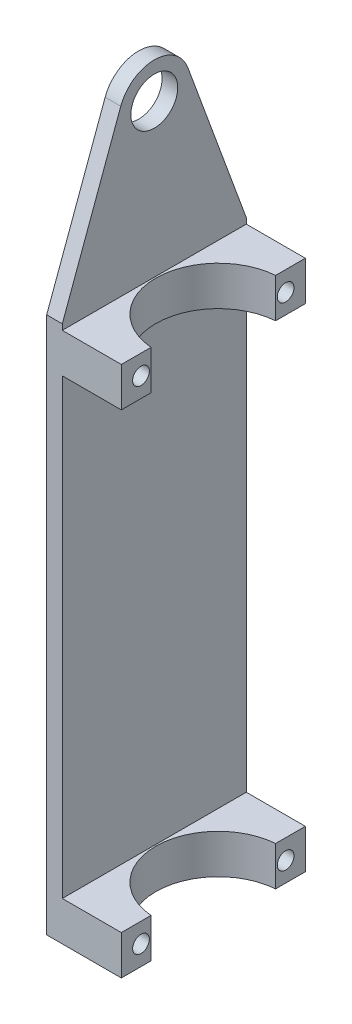
ISO-10303-21;
HEADER;
FILE_DESCRIPTION(('STEP AP214'),'2;1');
FILE_NAME('part.step','',(''),(''),'','','');
FILE_SCHEMA(('AUTOMOTIVE_DESIGN { 1 0 10303 214 1 1 1 1 }'));
ENDSEC;
DATA;
#1=APPLICATION_CONTEXT('core data for automotive mechanical design processes');
#2=APPLICATION_PROTOCOL_DEFINITION('international standard','automotive_design',2000,#1);
#3=PRODUCT_CONTEXT('',#1,'mechanical');
#4=PRODUCT('Part','Part','',(#3));
#5=PRODUCT_RELATED_PRODUCT_CATEGORY('part','',(#4));
#6=PRODUCT_DEFINITION_FORMATION('','',#4);
#7=PRODUCT_DEFINITION_CONTEXT('part definition',#1,'design');
#8=PRODUCT_DEFINITION('design','',#6,#7);
#9=PRODUCT_DEFINITION_SHAPE('','',#8);
#10=(LENGTH_UNIT() NAMED_UNIT(*) SI_UNIT(.MILLI.,.METRE.));
#11=(NAMED_UNIT(*) PLANE_ANGLE_UNIT() SI_UNIT($,.RADIAN.));
#12=(NAMED_UNIT(*) SI_UNIT($,.STERADIAN.) SOLID_ANGLE_UNIT());
#13=UNCERTAINTY_MEASURE_WITH_UNIT(LENGTH_MEASURE(1.E-05),#10,'distance_accuracy_value','');
#14=(GEOMETRIC_REPRESENTATION_CONTEXT(3) GLOBAL_UNCERTAINTY_ASSIGNED_CONTEXT((#13)) GLOBAL_UNIT_ASSIGNED_CONTEXT((#10,
#11,#12)) REPRESENTATION_CONTEXT('',''));
#15=CARTESIAN_POINT('',(0.,0.,0.));
#16=DIRECTION('',(0.,0.,1.));
#17=DIRECTION('',(1.,0.,0.));
#18=AXIS2_PLACEMENT_3D('',#15,#16,#17);
#19=CARTESIAN_POINT('',(0.,0.,0.));
#20=DIRECTION('',(1.,0.,0.));
#21=DIRECTION('',(0.,0.,-1.));
#22=AXIS2_PLACEMENT_3D('',#19,#20,#21);
#23=PLANE('',#22);
#24=CARTESIAN_POINT('',(0.,35.,0.));
#25=DIRECTION('',(1.,0.,0.));
#26=DIRECTION('',(0.,0.,-1.));
#27=AXIS2_PLACEMENT_3D('',#24,#25,#26);
#28=CIRCLE('',#27,7.2625);
#29=CARTESIAN_POINT('',(0.,37.5038062873819,6.81724726889577));
#30=VERTEX_POINT('',#29);
#31=CARTESIAN_POINT('',(0.,37.5038062873819,-6.81724726889575));
#32=VERTEX_POINT('',#31);
#33=EDGE_CURVE('E219',#30,#32,#28,.F.);
#34=ORIENTED_EDGE('',*,*,#33,.T.);
#35=DIRECTION('',(0.,-0.938691534443478,-0.344758180706635));
#36=VECTOR('',#35,1.);
#37=CARTESIAN_POINT('',(0.,6.66384339812713,-18.1440027669766));
#38=LINE('',#37,#36);
#39=CARTESIAN_POINT('',(0.,5.15,-18.7));
#40=VERTEX_POINT('',#39);
#41=EDGE_CURVE('E253',#32,#40,#38,.T.);
#42=ORIENTED_EDGE('',*,*,#41,.T.);
#43=DIRECTION('',(0.,1.,0.));
#44=VECTOR('',#43,1.);
#45=CARTESIAN_POINT('',(0.,0.,-18.7));
#46=LINE('',#45,#44);
#47=CARTESIAN_POINT('',(0.,-104.,-18.7));
#48=VERTEX_POINT('',#47);
#49=EDGE_CURVE('E250',#48,#40,#46,.T.);
#50=ORIENTED_EDGE('',*,*,#49,.F.);
#51=DIRECTION('',(0.,0.,-1.));
#52=VECTOR('',#51,1.);
#53=CARTESIAN_POINT('',(0.,-104.,0.));
#54=LINE('',#53,#52);
#55=CARTESIAN_POINT('',(0.,-104.,18.7));
#56=VERTEX_POINT('',#55);
#57=EDGE_CURVE('E248',#56,#48,#54,.T.);
#58=ORIENTED_EDGE('',*,*,#57,.F.);
#59=DIRECTION('',(0.,1.,0.));
#60=VECTOR('',#59,1.);
#61=CARTESIAN_POINT('',(0.,0.,18.7));
#62=LINE('',#61,#60);
#63=CARTESIAN_POINT('',(0.,5.15,18.7));
#64=VERTEX_POINT('',#63);
#65=EDGE_CURVE('E245',#56,#64,#62,.T.);
#66=ORIENTED_EDGE('',*,*,#65,.T.);
#67=DIRECTION('',(0.,0.938691534443478,-0.344758180706634));
#68=VECTOR('',#67,1.);
#69=CARTESIAN_POINT('',(0.,6.66384339812712,18.1440027669766));
#70=LINE('',#69,#68);
#71=EDGE_CURVE('E242',#64,#30,#70,.T.);
#72=ORIENTED_EDGE('',*,*,#71,.T.);
#73=EDGE_LOOP('',(#34,#42,#50,#58,#66,#72));
#74=FACE_BOUND('',#73,.T.);
#75=CARTESIAN_POINT('',(0.,35.,0.));
#76=DIRECTION('',(1.,0.,0.));
#77=DIRECTION('',(0.,0.,-1.));
#78=AXIS2_PLACEMENT_3D('',#75,#76,#77);
#79=CIRCLE('',#78,4.7625);
#80=CARTESIAN_POINT('',(0.,35.,-4.7625));
#81=VERTEX_POINT('',#80);
#82=EDGE_CURVE('E224',#81,#81,#79,.T.);
#83=ORIENTED_EDGE('',*,*,#82,.T.);
#84=EDGE_LOOP('',(#83));
#85=FACE_BOUND('',#84,.T.);
#86=CARTESIAN_POINT('',(0.,-100.,-14.7));
#87=DIRECTION('',(-1.,0.,0.));
#88=DIRECTION('',(0.,0.,1.));
#89=AXIS2_PLACEMENT_3D('',#86,#87,#88);
#90=CIRCLE('',#89,3.25);
#91=CARTESIAN_POINT('',(0.,-100.,-11.45));
#92=VERTEX_POINT('',#91);
#93=EDGE_CURVE('E396',#92,#92,#90,.T.);
#94=ORIENTED_EDGE('',*,*,#93,.F.);
#95=EDGE_LOOP('',(#94));
#96=FACE_BOUND('',#95,.T.);
#97=CARTESIAN_POINT('',(0.,-100.,14.7));
#98=DIRECTION('',(-1.,0.,0.));
#99=DIRECTION('',(0.,0.,1.));
#100=AXIS2_PLACEMENT_3D('',#97,#98,#99);
#101=CIRCLE('',#100,3.25);
#102=CARTESIAN_POINT('',(0.,-100.,17.95));
#103=VERTEX_POINT('',#102);
#104=EDGE_CURVE('E407',#103,#103,#101,.T.);
#105=ORIENTED_EDGE('',*,*,#104,.F.);
#106=EDGE_LOOP('',(#105));
#107=FACE_BOUND('',#106,.T.);
#108=CARTESIAN_POINT('',(0.,0.,14.7));
#109=DIRECTION('',(-1.,0.,0.));
#110=DIRECTION('',(0.,0.,1.));
#111=AXIS2_PLACEMENT_3D('',#108,#109,#110);
#112=CIRCLE('',#111,3.25);
#113=CARTESIAN_POINT('',(0.,0.,17.95));
#114=VERTEX_POINT('',#113);
#115=EDGE_CURVE('E419',#114,#114,#112,.T.);
#116=ORIENTED_EDGE('',*,*,#115,.F.);
#117=EDGE_LOOP('',(#116));
#118=FACE_BOUND('',#117,.T.);
#119=CARTESIAN_POINT('',(0.,0.,-14.7));
#120=DIRECTION('',(-1.,0.,0.));
#121=DIRECTION('',(0.,0.,1.));
#122=AXIS2_PLACEMENT_3D('',#119,#120,#121);
#123=CIRCLE('',#122,3.25);
#124=CARTESIAN_POINT('',(0.,0.,-11.45));
#125=VERTEX_POINT('',#124);
#126=EDGE_CURVE('E431',#125,#125,#123,.T.);
#127=ORIENTED_EDGE('',*,*,#126,.F.);
#128=EDGE_LOOP('',(#127));
#129=FACE_BOUND('',#128,.T.);
#130=ADVANCED_FACE('F41',(#74,#85,#96,#107,#118,#129),#23,.F.);
#131=CARTESIAN_POINT('',(15.175,0.,0.));
#132=DIRECTION('',(-1.,0.,0.));
#133=DIRECTION('',(0.,0.,1.));
#134=AXIS2_PLACEMENT_3D('',#131,#132,#133);
#135=PLANE('',#134);
#136=CARTESIAN_POINT('',(15.175,0.,14.7));
#137=DIRECTION('',(-1.,0.,0.));
#138=DIRECTION('',(0.,0.,1.));
#139=AXIS2_PLACEMENT_3D('',#136,#137,#138);
#140=CIRCLE('',#139,1.7);
#141=CARTESIAN_POINT('',(15.175,0.,16.4));
#142=VERTEX_POINT('',#141);
#143=EDGE_CURVE('E410',#142,#142,#140,.T.);
#144=ORIENTED_EDGE('',*,*,#143,.T.);
#145=EDGE_LOOP('',(#144));
#146=FACE_BOUND('',#145,.T.);
#147=DIRECTION('',(0.,0.,-1.));
#148=VECTOR('',#147,1.);
#149=CARTESIAN_POINT('',(15.175,-4.,18.7));
#150=LINE('',#149,#148);
#151=CARTESIAN_POINT('',(15.175,-4.,18.7));
#152=VERTEX_POINT('',#151);
#153=CARTESIAN_POINT('',(15.175,-4.,12.6605687076055));
#154=VERTEX_POINT('',#153);
#155=EDGE_CURVE('E194',#152,#154,#150,.T.);
#156=ORIENTED_EDGE('',*,*,#155,.T.);
#157=DIRECTION('',(0.,1.,0.));
#158=VECTOR('',#157,1.);
#159=CARTESIAN_POINT('',(15.175,-104.,12.6605687076055));
#160=LINE('',#159,#158);
#161=CARTESIAN_POINT('',(15.175,4.,12.6605687076055));
#162=VERTEX_POINT('',#161);
#163=EDGE_CURVE('E183',#154,#162,#160,.T.);
#164=ORIENTED_EDGE('',*,*,#163,.T.);
#165=DIRECTION('',(0.,0.,1.));
#166=VECTOR('',#165,1.);
#167=CARTESIAN_POINT('',(15.175,4.,18.7));
#168=LINE('',#167,#166);
#169=CARTESIAN_POINT('',(15.175,4.,18.7));
#170=VERTEX_POINT('',#169);
#171=EDGE_CURVE('E199',#162,#170,#168,.T.);
#172=ORIENTED_EDGE('',*,*,#171,.T.);
#173=DIRECTION('',(0.,-1.,0.));
#174=VECTOR('',#173,1.);
#175=CARTESIAN_POINT('',(15.175,-4.,18.7));
#176=LINE('',#175,#174);
#177=EDGE_CURVE('E189',#170,#152,#176,.T.);
#178=ORIENTED_EDGE('',*,*,#177,.T.);
#179=EDGE_LOOP('',(#156,#164,#172,#178));
#180=FACE_BOUND('',#179,.T.);
#181=ADVANCED_FACE('F286',(#146,#180),#135,.F.);
#182=CARTESIAN_POINT('',(15.175,0.,0.));
#183=DIRECTION('',(-1.,0.,0.));
#184=DIRECTION('',(0.,0.,1.));
#185=AXIS2_PLACEMENT_3D('',#182,#183,#184);
#186=PLANE('',#185);
#187=CARTESIAN_POINT('',(15.175,-100.,14.7));
#188=DIRECTION('',(-1.,0.,0.));
#189=DIRECTION('',(0.,0.,1.));
#190=AXIS2_PLACEMENT_3D('',#187,#188,#189);
#191=CIRCLE('',#190,1.69999999999999);
#192=CARTESIAN_POINT('',(15.175,-100.,16.4));
#193=VERTEX_POINT('',#192);
#194=EDGE_CURVE('E399',#193,#193,#191,.T.);
#195=ORIENTED_EDGE('',*,*,#194,.T.);
#196=EDGE_LOOP('',(#195));
#197=FACE_BOUND('',#196,.T.);
#198=DIRECTION('',(0.,0.,-1.));
#199=VECTOR('',#198,1.);
#200=CARTESIAN_POINT('',(15.175,-104.,18.7));
#201=LINE('',#200,#199);
#202=CARTESIAN_POINT('',(15.175,-104.,18.7));
#203=VERTEX_POINT('',#202);
#204=CARTESIAN_POINT('',(15.175,-104.,12.6605687076055));
#205=VERTEX_POINT('',#204);
#206=EDGE_CURVE('E161',#203,#205,#201,.T.);
#207=ORIENTED_EDGE('',*,*,#206,.T.);
#208=DIRECTION('',(0.,1.,0.));
#209=VECTOR('',#208,1.);
#210=CARTESIAN_POINT('',(15.175,-104.,12.6605687076055));
#211=LINE('',#210,#209);
#212=CARTESIAN_POINT('',(15.175,-96.,12.6605687076055));
#213=VERTEX_POINT('',#212);
#214=EDGE_CURVE('E11',#205,#213,#211,.T.);
#215=ORIENTED_EDGE('',*,*,#214,.T.);
#216=DIRECTION('',(0.,0.,1.));
#217=VECTOR('',#216,1.);
#218=CARTESIAN_POINT('',(15.175,-96.,18.7));
#219=LINE('',#218,#217);
#220=CARTESIAN_POINT('',(15.175,-96.,18.7));
#221=VERTEX_POINT('',#220);
#222=EDGE_CURVE('E172',#213,#221,#219,.T.);
#223=ORIENTED_EDGE('',*,*,#222,.T.);
#224=DIRECTION('',(0.,-1.,0.));
#225=VECTOR('',#224,1.);
#226=CARTESIAN_POINT('',(15.175,-104.,18.7));
#227=LINE('',#226,#225);
#228=EDGE_CURVE('E169',#221,#203,#227,.T.);
#229=ORIENTED_EDGE('',*,*,#228,.T.);
#230=EDGE_LOOP('',(#207,#215,#223,#229));
#231=FACE_BOUND('',#230,.T.);
#232=ADVANCED_FACE('F167',(#197,#231),#186,.F.);
#233=CARTESIAN_POINT('',(3.175,0.,0.));
#234=DIRECTION('',(1.,0.,0.));
#235=DIRECTION('',(0.,0.,-1.));
#236=AXIS2_PLACEMENT_3D('',#233,#234,#235);
#237=PLANE('',#236);
#238=DIRECTION('',(0.,1.,0.));
#239=VECTOR('',#238,1.);
#240=CARTESIAN_POINT('',(3.175,0.,18.7));
#241=LINE('',#240,#239);
#242=CARTESIAN_POINT('',(3.175,-96.,18.7));
#243=VERTEX_POINT('',#242);
#244=CARTESIAN_POINT('',(3.175,-4.,18.7));
#245=VERTEX_POINT('',#244);
#246=EDGE_CURVE('E228',#243,#245,#241,.T.);
#247=ORIENTED_EDGE('',*,*,#246,.F.);
#248=DIRECTION('',(0.,0.,1.));
#249=VECTOR('',#248,1.);
#250=CARTESIAN_POINT('',(3.175,-96.,18.7));
#251=LINE('',#250,#249);
#252=CARTESIAN_POINT('',(3.175,-96.,-18.7));
#253=VERTEX_POINT('',#252);
#254=EDGE_CURVE('E181',#253,#243,#251,.T.);
#255=ORIENTED_EDGE('',*,*,#254,.F.);
#256=DIRECTION('',(0.,1.,0.));
#257=VECTOR('',#256,1.);
#258=CARTESIAN_POINT('',(3.175,0.,-18.7));
#259=LINE('',#258,#257);
#260=CARTESIAN_POINT('',(3.175,-4.,-18.7));
#261=VERTEX_POINT('',#260);
#262=EDGE_CURVE('E231',#253,#261,#259,.T.);
#263=ORIENTED_EDGE('',*,*,#262,.T.);
#264=DIRECTION('',(0.,0.,-1.));
#265=VECTOR('',#264,1.);
#266=CARTESIAN_POINT('',(3.175,-4.,18.7));
#267=LINE('',#266,#265);
#268=EDGE_CURVE('E188',#245,#261,#267,.T.);
#269=ORIENTED_EDGE('',*,*,#268,.F.);
#270=EDGE_LOOP('',(#247,#255,#263,#269));
#271=FACE_BOUND('',#270,.T.);
#272=ADVANCED_FACE('F329',(#271),#237,.T.);
#273=DIRECTION('',(0.,0.,1.));
#274=VECTOR('',#273,1.);
#275=CARTESIAN_POINT('',(3.175,4.,18.7));
#276=LINE('',#275,#274);
#277=CARTESIAN_POINT('',(3.175,4.,-18.7));
#278=VERTEX_POINT('',#277);
#279=CARTESIAN_POINT('',(3.175,4.,18.7));
#280=VERTEX_POINT('',#279);
#281=EDGE_CURVE('E193',#278,#280,#276,.T.);
#282=ORIENTED_EDGE('',*,*,#281,.F.);
#283=CARTESIAN_POINT('',(3.175,5.15,-18.7));
#284=VERTEX_POINT('',#283);
#285=EDGE_CURVE('E230',#278,#284,#259,.T.);
#286=ORIENTED_EDGE('',*,*,#285,.T.);
#287=DIRECTION('',(0.,-0.938691534443478,-0.344758180706635));
#288=VECTOR('',#287,1.);
#289=CARTESIAN_POINT('',(3.175,6.66384339812713,-18.1440027669766));
#290=LINE('',#289,#288);
#291=CARTESIAN_POINT('',(3.175,37.5038062873819,-6.81724726889575));
#292=VERTEX_POINT('',#291);
#293=EDGE_CURVE('E233',#292,#284,#290,.T.);
#294=ORIENTED_EDGE('',*,*,#293,.F.);
#295=CARTESIAN_POINT('',(3.175,35.,0.));
#296=DIRECTION('',(1.,0.,0.));
#297=DIRECTION('',(0.,0.,-1.));
#298=AXIS2_PLACEMENT_3D('',#295,#296,#297);
#299=CIRCLE('',#298,7.2625);
#300=CARTESIAN_POINT('',(3.175,37.5038062873819,6.81724726889577));
#301=VERTEX_POINT('',#300);
#302=EDGE_CURVE('E220',#301,#292,#299,.F.);
#303=ORIENTED_EDGE('',*,*,#302,.F.);
#304=DIRECTION('',(0.,0.938691534443478,-0.344758180706634));
#305=VECTOR('',#304,1.);
#306=CARTESIAN_POINT('',(3.175,6.66384339812712,18.1440027669766));
#307=LINE('',#306,#305);
#308=CARTESIAN_POINT('',(3.175,5.15,18.7));
#309=VERTEX_POINT('',#308);
#310=EDGE_CURVE('E223',#309,#301,#307,.T.);
#311=ORIENTED_EDGE('',*,*,#310,.F.);
#312=EDGE_CURVE('E227',#280,#309,#241,.T.);
#313=ORIENTED_EDGE('',*,*,#312,.F.);
#314=EDGE_LOOP('',(#282,#286,#294,#303,#311,#313));
#315=FACE_BOUND('',#314,.T.);
#316=CARTESIAN_POINT('',(3.175,35.,0.));
#317=DIRECTION('',(1.,0.,0.));
#318=DIRECTION('',(0.,0.,-1.));
#319=AXIS2_PLACEMENT_3D('',#316,#317,#318);
#320=CIRCLE('',#319,4.7625);
#321=CARTESIAN_POINT('',(3.175,35.,-4.7625));
#322=VERTEX_POINT('',#321);
#323=EDGE_CURVE('E236',#322,#322,#320,.T.);
#324=ORIENTED_EDGE('',*,*,#323,.F.);
#325=EDGE_LOOP('',(#324));
#326=FACE_BOUND('',#325,.T.);
#327=ADVANCED_FACE('F352',(#315,#326),#237,.T.);
#328=CARTESIAN_POINT('',(3.175,35.,0.));
#329=DIRECTION('',(-1.,0.,0.));
#330=DIRECTION('',(0.,0.,1.));
#331=AXIS2_PLACEMENT_3D('',#328,#329,#330);
#332=CYLINDRICAL_SURFACE('',#331,7.2625);
#333=ORIENTED_EDGE('',*,*,#33,.F.);
#334=DIRECTION('',(-1.,0.,0.));
#335=VECTOR('',#334,1.);
#336=CARTESIAN_POINT('',(3.175,37.5038062873819,6.81724726889577));
#337=LINE('',#336,#335);
#338=EDGE_CURVE('E268',#301,#30,#337,.T.);
#339=ORIENTED_EDGE('',*,*,#338,.F.);
#340=ORIENTED_EDGE('',*,*,#302,.T.);
#341=DIRECTION('',(-1.,0.,0.));
#342=VECTOR('',#341,1.);
#343=CARTESIAN_POINT('',(3.175,37.5038062873819,-6.81724726889575));
#344=LINE('',#343,#342);
#345=EDGE_CURVE('E239',#292,#32,#344,.T.);
#346=ORIENTED_EDGE('',*,*,#345,.T.);
#347=EDGE_LOOP('',(#333,#339,#340,#346));
#348=FACE_BOUND('',#347,.T.);
#349=ADVANCED_FACE('F43',(#348),#332,.T.);
#350=CARTESIAN_POINT('',(3.175,6.66384339812712,18.1440027669766));
#351=DIRECTION('',(0.,0.344758180706634,0.938691534443478));
#352=DIRECTION('',(0.,-0.938691534443478,0.344758180706634));
#353=AXIS2_PLACEMENT_3D('',#350,#351,#352);
#354=PLANE('',#353);
#355=ORIENTED_EDGE('',*,*,#71,.F.);
#356=DIRECTION('',(-1.,0.,0.));
#357=VECTOR('',#356,1.);
#358=CARTESIAN_POINT('',(3.175,5.15,18.7));
#359=LINE('',#358,#357);
#360=EDGE_CURVE('E266',#309,#64,#359,.T.);
#361=ORIENTED_EDGE('',*,*,#360,.F.);
#362=ORIENTED_EDGE('',*,*,#310,.T.);
#363=ORIENTED_EDGE('',*,*,#338,.T.);
#364=EDGE_LOOP('',(#355,#361,#362,#363));
#365=FACE_BOUND('',#364,.T.);
#366=ADVANCED_FACE('F346',(#365),#354,.T.);
#367=CARTESIAN_POINT('',(3.175,0.,18.7));
#368=DIRECTION('',(0.,0.,1.));
#369=DIRECTION('',(0.,-1.,0.));
#370=AXIS2_PLACEMENT_3D('',#367,#368,#369);
#371=PLANE('',#370);
#372=ORIENTED_EDGE('',*,*,#65,.F.);
#373=DIRECTION('',(-1.,0.,0.));
#374=VECTOR('',#373,1.);
#375=CARTESIAN_POINT('',(3.175,-104.,18.7));
#376=LINE('',#375,#374);
#377=EDGE_CURVE('E264',#203,#56,#376,.T.);
#378=ORIENTED_EDGE('',*,*,#377,.F.);
#379=ORIENTED_EDGE('',*,*,#228,.F.);
#380=DIRECTION('',(-1.,0.,0.));
#381=VECTOR('',#380,1.);
#382=CARTESIAN_POINT('',(15.175,-96.,18.7));
#383=LINE('',#382,#381);
#384=EDGE_CURVE('E180',#221,#243,#383,.T.);
#385=ORIENTED_EDGE('',*,*,#384,.T.);
#386=ORIENTED_EDGE('',*,*,#246,.T.);
#387=DIRECTION('',(-1.,0.,0.));
#388=VECTOR('',#387,1.);
#389=CARTESIAN_POINT('',(15.175,-4.,18.7));
#390=LINE('',#389,#388);
#391=EDGE_CURVE('E216',#152,#245,#390,.T.);
#392=ORIENTED_EDGE('',*,*,#391,.F.);
#393=ORIENTED_EDGE('',*,*,#177,.F.);
#394=DIRECTION('',(-1.,0.,0.));
#395=VECTOR('',#394,1.);
#396=CARTESIAN_POINT('',(15.175,4.,18.7));
#397=LINE('',#396,#395);
#398=EDGE_CURVE('E203',#170,#280,#397,.T.);
#399=ORIENTED_EDGE('',*,*,#398,.T.);
#400=ORIENTED_EDGE('',*,*,#312,.T.);
#401=ORIENTED_EDGE('',*,*,#360,.T.);
#402=EDGE_LOOP('',(#372,#378,#379,#385,#386,#392,#393,#399,#400,#401));
#403=FACE_BOUND('',#402,.T.);
#404=ADVANCED_FACE('F295',(#403),#371,.T.);
#405=CARTESIAN_POINT('',(3.175,-104.,0.));
#406=DIRECTION('',(0.,1.,0.));
#407=DIRECTION('',(0.,0.,1.));
#408=AXIS2_PLACEMENT_3D('',#405,#406,#407);
#409=PLANE('',#408);
#410=CARTESIAN_POINT('',(15.175,-104.,-12.6605687076055));
#411=VERTEX_POINT('',#410);
#412=CARTESIAN_POINT('',(15.175,-104.,-18.7));
#413=VERTEX_POINT('',#412);
#414=EDGE_CURVE('E164',#411,#413,#201,.T.);
#415=ORIENTED_EDGE('',*,*,#414,.F.);
#416=CARTESIAN_POINT('',(16.175,-104.,0.));
#417=DIRECTION('',(0.,1.,0.));
#418=DIRECTION('',(0.,0.,1.));
#419=AXIS2_PLACEMENT_3D('',#416,#417,#418);
#420=CIRCLE('',#419,12.7);
#421=EDGE_CURVE('E64',#411,#205,#420,.T.);
#422=ORIENTED_EDGE('',*,*,#421,.T.);
#423=ORIENTED_EDGE('',*,*,#206,.F.);
#424=ORIENTED_EDGE('',*,*,#377,.T.);
#425=ORIENTED_EDGE('',*,*,#57,.T.);
#426=DIRECTION('',(-1.,0.,0.));
#427=VECTOR('',#426,1.);
#428=CARTESIAN_POINT('',(3.175,-104.,-18.7));
#429=LINE('',#428,#427);
#430=EDGE_CURVE('E261',#413,#48,#429,.T.);
#431=ORIENTED_EDGE('',*,*,#430,.F.);
#432=EDGE_LOOP('',(#415,#422,#423,#424,#425,#431));
#433=FACE_BOUND('',#432,.T.);
#434=ADVANCED_FACE('F160',(#433),#409,.F.);
#435=CARTESIAN_POINT('',(3.175,0.,-18.7));
#436=DIRECTION('',(0.,0.,1.));
#437=DIRECTION('',(0.,-1.,0.));
#438=AXIS2_PLACEMENT_3D('',#435,#436,#437);
#439=PLANE('',#438);
#440=ORIENTED_EDGE('',*,*,#49,.T.);
#441=DIRECTION('',(-1.,0.,0.));
#442=VECTOR('',#441,1.);
#443=CARTESIAN_POINT('',(3.175,5.15,-18.7));
#444=LINE('',#443,#442);
#445=EDGE_CURVE('E259',#284,#40,#444,.T.);
#446=ORIENTED_EDGE('',*,*,#445,.F.);
#447=ORIENTED_EDGE('',*,*,#285,.F.);
#448=DIRECTION('',(-1.,0.,0.));
#449=VECTOR('',#448,1.);
#450=CARTESIAN_POINT('',(15.175,4.,-18.7));
#451=LINE('',#450,#449);
#452=CARTESIAN_POINT('',(15.175,4.,-18.7));
#453=VERTEX_POINT('',#452);
#454=EDGE_CURVE('E210',#453,#278,#451,.T.);
#455=ORIENTED_EDGE('',*,*,#454,.F.);
#456=DIRECTION('',(0.,1.,0.));
#457=VECTOR('',#456,1.);
#458=CARTESIAN_POINT('',(15.175,-4.,-18.7));
#459=LINE('',#458,#457);
#460=CARTESIAN_POINT('',(15.175,-4.,-18.7));
#461=VERTEX_POINT('',#460);
#462=EDGE_CURVE('E197',#461,#453,#459,.T.);
#463=ORIENTED_EDGE('',*,*,#462,.F.);
#464=DIRECTION('',(-1.,0.,0.));
#465=VECTOR('',#464,1.);
#466=CARTESIAN_POINT('',(15.175,-4.,-18.7));
#467=LINE('',#466,#465);
#468=EDGE_CURVE('E213',#461,#261,#467,.T.);
#469=ORIENTED_EDGE('',*,*,#468,.T.);
#470=ORIENTED_EDGE('',*,*,#262,.F.);
#471=DIRECTION('',(-1.,0.,0.));
#472=VECTOR('',#471,1.);
#473=CARTESIAN_POINT('',(15.175,-96.,-18.7));
#474=LINE('',#473,#472);
#475=CARTESIAN_POINT('',(15.175,-96.,-18.7));
#476=VERTEX_POINT('',#475);
#477=EDGE_CURVE('E186',#476,#253,#474,.T.);
#478=ORIENTED_EDGE('',*,*,#477,.F.);
#479=DIRECTION('',(0.,1.,0.));
#480=VECTOR('',#479,1.);
#481=CARTESIAN_POINT('',(15.175,-104.,-18.7));
#482=LINE('',#481,#480);
#483=EDGE_CURVE('E170',#413,#476,#482,.T.);
#484=ORIENTED_EDGE('',*,*,#483,.F.);
#485=ORIENTED_EDGE('',*,*,#430,.T.);
#486=EDGE_LOOP('',(#440,#446,#447,#455,#463,#469,#470,#478,#484,#485));
#487=FACE_BOUND('',#486,.T.);
#488=ADVANCED_FACE('F338',(#487),#439,.F.);
#489=CARTESIAN_POINT('',(3.175,6.66384339812713,-18.1440027669766));
#490=DIRECTION('',(0.,0.344758180706635,-0.938691534443478));
#491=DIRECTION('',(0.,0.938691534443478,0.344758180706635));
#492=AXIS2_PLACEMENT_3D('',#489,#490,#491);
#493=PLANE('',#492);
#494=ORIENTED_EDGE('',*,*,#41,.F.);
#495=ORIENTED_EDGE('',*,*,#345,.F.);
#496=ORIENTED_EDGE('',*,*,#293,.T.);
#497=ORIENTED_EDGE('',*,*,#445,.T.);
#498=EDGE_LOOP('',(#494,#495,#496,#497));
#499=FACE_BOUND('',#498,.T.);
#500=ADVANCED_FACE('F334',(#499),#493,.T.);
#501=CARTESIAN_POINT('',(3.175,35.,0.));
#502=DIRECTION('',(-1.,0.,0.));
#503=DIRECTION('',(0.,0.,1.));
#504=AXIS2_PLACEMENT_3D('',#501,#502,#503);
#505=CYLINDRICAL_SURFACE('',#504,4.7625);
#506=ORIENTED_EDGE('',*,*,#323,.T.);
#507=EDGE_LOOP('',(#506));
#508=FACE_BOUND('',#507,.T.);
#509=ORIENTED_EDGE('',*,*,#82,.F.);
#510=EDGE_LOOP('',(#509));
#511=FACE_BOUND('',#510,.T.);
#512=ADVANCED_FACE('F331',(#508,#511),#505,.F.);
#513=CARTESIAN_POINT('',(15.175,-4.,18.7));
#514=DIRECTION('',(0.,1.,0.));
#515=DIRECTION('',(0.,0.,1.));
#516=AXIS2_PLACEMENT_3D('',#513,#514,#515);
#517=PLANE('',#516);
#518=CARTESIAN_POINT('',(15.175,-4.,-12.6605687076055));
#519=VERTEX_POINT('',#518);
#520=EDGE_CURVE('E192',#519,#461,#150,.T.);
#521=ORIENTED_EDGE('',*,*,#520,.F.);
#522=CARTESIAN_POINT('',(16.175,-4.,0.));
#523=DIRECTION('',(0.,1.,0.));
#524=DIRECTION('',(0.,0.,1.));
#525=AXIS2_PLACEMENT_3D('',#522,#523,#524);
#526=CIRCLE('',#525,12.7);
#527=EDGE_CURVE('E56',#519,#154,#526,.T.);
#528=ORIENTED_EDGE('',*,*,#527,.T.);
#529=ORIENTED_EDGE('',*,*,#155,.F.);
#530=ORIENTED_EDGE('',*,*,#391,.T.);
#531=ORIENTED_EDGE('',*,*,#268,.T.);
#532=ORIENTED_EDGE('',*,*,#468,.F.);
#533=EDGE_LOOP('',(#521,#528,#529,#530,#531,#532));
#534=FACE_BOUND('',#533,.T.);
#535=ADVANCED_FACE('F300',(#534),#517,.F.);
#536=CARTESIAN_POINT('',(15.175,4.,18.7));
#537=DIRECTION('',(0.,-1.,0.));
#538=DIRECTION('',(0.,0.,-1.));
#539=AXIS2_PLACEMENT_3D('',#536,#537,#538);
#540=PLANE('',#539);
#541=ORIENTED_EDGE('',*,*,#171,.F.);
#542=CARTESIAN_POINT('',(16.175,4.,0.));
#543=DIRECTION('',(0.,-1.,0.));
#544=DIRECTION('',(0.,0.,-1.));
#545=AXIS2_PLACEMENT_3D('',#542,#543,#544);
#546=CIRCLE('',#545,12.7);
#547=CARTESIAN_POINT('',(15.175,4.,-12.6605687076055));
#548=VERTEX_POINT('',#547);
#549=EDGE_CURVE('E277',#162,#548,#546,.T.);
#550=ORIENTED_EDGE('',*,*,#549,.T.);
#551=EDGE_CURVE('E200',#453,#548,#168,.T.);
#552=ORIENTED_EDGE('',*,*,#551,.F.);
#553=ORIENTED_EDGE('',*,*,#454,.T.);
#554=ORIENTED_EDGE('',*,*,#281,.T.);
#555=ORIENTED_EDGE('',*,*,#398,.F.);
#556=EDGE_LOOP('',(#541,#550,#552,#553,#554,#555));
#557=FACE_BOUND('',#556,.T.);
#558=ADVANCED_FACE('F289',(#557),#540,.F.);
#559=CARTESIAN_POINT('',(15.175,0.,-14.7));
#560=DIRECTION('',(-1.,0.,0.));
#561=DIRECTION('',(0.,0.,1.));
#562=AXIS2_PLACEMENT_3D('',#559,#560,#561);
#563=CIRCLE('',#562,1.7);
#564=CARTESIAN_POINT('',(15.175,0.,-13.));
#565=VERTEX_POINT('',#564);
#566=EDGE_CURVE('E422',#565,#565,#563,.T.);
#567=ORIENTED_EDGE('',*,*,#566,.T.);
#568=EDGE_LOOP('',(#567));
#569=FACE_BOUND('',#568,.T.);
#570=ORIENTED_EDGE('',*,*,#551,.T.);
#571=DIRECTION('',(0.,1.,0.));
#572=VECTOR('',#571,1.);
#573=CARTESIAN_POINT('',(15.175,-104.,-12.6605687076055));
#574=LINE('',#573,#572);
#575=EDGE_CURVE('E275',#548,#519,#574,.F.);
#576=ORIENTED_EDGE('',*,*,#575,.T.);
#577=ORIENTED_EDGE('',*,*,#520,.T.);
#578=ORIENTED_EDGE('',*,*,#462,.T.);
#579=EDGE_LOOP('',(#570,#576,#577,#578));
#580=FACE_BOUND('',#579,.T.);
#581=ADVANCED_FACE('F304',(#569,#580),#135,.F.);
#582=CARTESIAN_POINT('',(15.175,-96.,18.7));
#583=DIRECTION('',(0.,-1.,0.));
#584=DIRECTION('',(0.,0.,-1.));
#585=AXIS2_PLACEMENT_3D('',#582,#583,#584);
#586=PLANE('',#585);
#587=ORIENTED_EDGE('',*,*,#222,.F.);
#588=CARTESIAN_POINT('',(16.175,-96.,0.));
#589=DIRECTION('',(0.,-1.,0.));
#590=DIRECTION('',(0.,0.,-1.));
#591=AXIS2_PLACEMENT_3D('',#588,#589,#590);
#592=CIRCLE('',#591,12.7);
#593=CARTESIAN_POINT('',(15.175,-96.,-12.6605687076055));
#594=VERTEX_POINT('',#593);
#595=EDGE_CURVE('E153',#213,#594,#592,.T.);
#596=ORIENTED_EDGE('',*,*,#595,.T.);
#597=EDGE_CURVE('E177',#476,#594,#219,.T.);
#598=ORIENTED_EDGE('',*,*,#597,.F.);
#599=ORIENTED_EDGE('',*,*,#477,.T.);
#600=ORIENTED_EDGE('',*,*,#254,.T.);
#601=ORIENTED_EDGE('',*,*,#384,.F.);
#602=EDGE_LOOP('',(#587,#596,#598,#599,#600,#601));
#603=FACE_BOUND('',#602,.T.);
#604=ADVANCED_FACE('F273',(#603),#586,.F.);
#605=CARTESIAN_POINT('',(15.175,-100.,-14.7));
#606=DIRECTION('',(-1.,0.,0.));
#607=DIRECTION('',(0.,0.,1.));
#608=AXIS2_PLACEMENT_3D('',#605,#606,#607);
#609=CIRCLE('',#608,1.69999999999999);
#610=CARTESIAN_POINT('',(15.175,-100.,-13.));
#611=VERTEX_POINT('',#610);
#612=EDGE_CURVE('E165',#611,#611,#609,.T.);
#613=ORIENTED_EDGE('',*,*,#612,.T.);
#614=EDGE_LOOP('',(#613));
#615=FACE_BOUND('',#614,.T.);
#616=ORIENTED_EDGE('',*,*,#597,.T.);
#617=DIRECTION('',(0.,1.,0.));
#618=VECTOR('',#617,1.);
#619=CARTESIAN_POINT('',(15.175,-104.,-12.6605687076055));
#620=LINE('',#619,#618);
#621=EDGE_CURVE('E49',#594,#411,#620,.F.);
#622=ORIENTED_EDGE('',*,*,#621,.T.);
#623=ORIENTED_EDGE('',*,*,#414,.T.);
#624=ORIENTED_EDGE('',*,*,#483,.T.);
#625=EDGE_LOOP('',(#616,#622,#623,#624));
#626=FACE_BOUND('',#625,.T.);
#627=ADVANCED_FACE('F270',(#615,#626),#186,.F.);
#628=CARTESIAN_POINT('',(16.175,-104.,0.));
#629=DIRECTION('',(0.,1.,0.));
#630=DIRECTION('',(0.,0.,1.));
#631=AXIS2_PLACEMENT_3D('',#628,#629,#630);
#632=CYLINDRICAL_SURFACE('',#631,12.7);
#633=ORIENTED_EDGE('',*,*,#421,.F.);
#634=ORIENTED_EDGE('',*,*,#621,.F.);
#635=ORIENTED_EDGE('',*,*,#595,.F.);
#636=ORIENTED_EDGE('',*,*,#214,.F.);
#637=EDGE_LOOP('',(#633,#634,#635,#636));
#638=FACE_BOUND('',#637,.T.);
#639=ADVANCED_FACE('F151',(#638),#632,.F.);
#640=ORIENTED_EDGE('',*,*,#527,.F.);
#641=ORIENTED_EDGE('',*,*,#575,.F.);
#642=ORIENTED_EDGE('',*,*,#549,.F.);
#643=ORIENTED_EDGE('',*,*,#163,.F.);
#644=EDGE_LOOP('',(#640,#641,#642,#643));
#645=FACE_BOUND('',#644,.T.);
#646=ADVANCED_FACE('F306',(#645),#632,.F.);
#647=CARTESIAN_POINT('',(0.,-100.,-14.7));
#648=DIRECTION('',(-1.,0.,0.));
#649=DIRECTION('',(0.,0.,1.));
#650=AXIS2_PLACEMENT_3D('',#647,#648,#649);
#651=CYLINDRICAL_SURFACE('',#650,1.69999999999999);
#652=ORIENTED_EDGE('',*,*,#612,.F.);
#653=EDGE_LOOP('',(#652));
#654=FACE_BOUND('',#653,.T.);
#655=CARTESIAN_POINT('',(3.,-100.,-14.7));
#656=DIRECTION('',(-1.,0.,0.));
#657=DIRECTION('',(0.,0.,1.));
#658=AXIS2_PLACEMENT_3D('',#655,#656,#657);
#659=CIRCLE('',#658,1.69999999999999);
#660=CARTESIAN_POINT('',(3.,-100.,-13.));
#661=VERTEX_POINT('',#660);
#662=EDGE_CURVE('E389',#661,#661,#659,.T.);
#663=ORIENTED_EDGE('',*,*,#662,.T.);
#664=EDGE_LOOP('',(#663));
#665=FACE_BOUND('',#664,.T.);
#666=ADVANCED_FACE('F308',(#654,#665),#651,.F.);
#667=CARTESIAN_POINT('',(3.,-98.3,-14.7));
#668=DIRECTION('',(1.,0.,0.));
#669=DIRECTION('',(0.,0.,-1.));
#670=AXIS2_PLACEMENT_3D('',#667,#668,#669);
#671=PLANE('',#670);
#672=ORIENTED_EDGE('',*,*,#662,.F.);
#673=EDGE_LOOP('',(#672));
#674=FACE_BOUND('',#673,.T.);
#675=CARTESIAN_POINT('',(3.,-100.,-14.7));
#676=DIRECTION('',(-1.,0.,0.));
#677=DIRECTION('',(0.,0.,1.));
#678=AXIS2_PLACEMENT_3D('',#675,#676,#677);
#679=CIRCLE('',#678,3.25);
#680=CARTESIAN_POINT('',(3.,-100.,-11.45));
#681=VERTEX_POINT('',#680);
#682=EDGE_CURVE('E391',#681,#681,#679,.T.);
#683=ORIENTED_EDGE('',*,*,#682,.T.);
#684=EDGE_LOOP('',(#683));
#685=FACE_BOUND('',#684,.T.);
#686=ADVANCED_FACE('F314',(#674,#685),#671,.F.);
#687=CARTESIAN_POINT('',(0.,-100.,-14.7));
#688=DIRECTION('',(-1.,0.,0.));
#689=DIRECTION('',(0.,0.,1.));
#690=AXIS2_PLACEMENT_3D('',#687,#688,#689);
#691=CYLINDRICAL_SURFACE('',#690,3.25);
#692=ORIENTED_EDGE('',*,*,#682,.F.);
#693=EDGE_LOOP('',(#692));
#694=FACE_BOUND('',#693,.T.);
#695=ORIENTED_EDGE('',*,*,#93,.T.);
#696=EDGE_LOOP('',(#695));
#697=FACE_BOUND('',#696,.T.);
#698=ADVANCED_FACE('F475',(#694,#697),#691,.F.);
#699=CARTESIAN_POINT('',(0.,-100.,14.7));
#700=DIRECTION('',(-1.,0.,0.));
#701=DIRECTION('',(0.,0.,1.));
#702=AXIS2_PLACEMENT_3D('',#699,#700,#701);
#703=CYLINDRICAL_SURFACE('',#702,1.69999999999999);
#704=ORIENTED_EDGE('',*,*,#194,.F.);
#705=EDGE_LOOP('',(#704));
#706=FACE_BOUND('',#705,.T.);
#707=CARTESIAN_POINT('',(3.,-100.,14.7));
#708=DIRECTION('',(-1.,0.,0.));
#709=DIRECTION('',(0.,0.,1.));
#710=AXIS2_PLACEMENT_3D('',#707,#708,#709);
#711=CIRCLE('',#710,1.69999999999999);
#712=CARTESIAN_POINT('',(3.,-100.,16.4));
#713=VERTEX_POINT('',#712);
#714=EDGE_CURVE('E401',#713,#713,#711,.T.);
#715=ORIENTED_EDGE('',*,*,#714,.T.);
#716=EDGE_LOOP('',(#715));
#717=FACE_BOUND('',#716,.T.);
#718=ADVANCED_FACE('F471',(#706,#717),#703,.F.);
#719=CARTESIAN_POINT('',(3.,-98.3,14.7));
#720=DIRECTION('',(1.,0.,0.));
#721=DIRECTION('',(0.,0.,-1.));
#722=AXIS2_PLACEMENT_3D('',#719,#720,#721);
#723=PLANE('',#722);
#724=ORIENTED_EDGE('',*,*,#714,.F.);
#725=EDGE_LOOP('',(#724));
#726=FACE_BOUND('',#725,.T.);
#727=CARTESIAN_POINT('',(3.,-100.,14.7));
#728=DIRECTION('',(-1.,0.,0.));
#729=DIRECTION('',(0.,0.,1.));
#730=AXIS2_PLACEMENT_3D('',#727,#728,#729);
#731=CIRCLE('',#730,3.25);
#732=CARTESIAN_POINT('',(3.,-100.,17.95));
#733=VERTEX_POINT('',#732);
#734=EDGE_CURVE('E404',#733,#733,#731,.T.);
#735=ORIENTED_EDGE('',*,*,#734,.T.);
#736=EDGE_LOOP('',(#735));
#737=FACE_BOUND('',#736,.T.);
#738=ADVANCED_FACE('F467',(#726,#737),#723,.F.);
#739=CARTESIAN_POINT('',(0.,-100.,14.7));
#740=DIRECTION('',(-1.,0.,0.));
#741=DIRECTION('',(0.,0.,1.));
#742=AXIS2_PLACEMENT_3D('',#739,#740,#741);
#743=CYLINDRICAL_SURFACE('',#742,3.25);
#744=ORIENTED_EDGE('',*,*,#734,.F.);
#745=EDGE_LOOP('',(#744));
#746=FACE_BOUND('',#745,.T.);
#747=ORIENTED_EDGE('',*,*,#104,.T.);
#748=EDGE_LOOP('',(#747));
#749=FACE_BOUND('',#748,.T.);
#750=ADVANCED_FACE('F463',(#746,#749),#743,.F.);
#751=CARTESIAN_POINT('',(0.,0.,14.7));
#752=DIRECTION('',(-1.,0.,0.));
#753=DIRECTION('',(0.,0.,1.));
#754=AXIS2_PLACEMENT_3D('',#751,#752,#753);
#755=CYLINDRICAL_SURFACE('',#754,1.7);
#756=ORIENTED_EDGE('',*,*,#143,.F.);
#757=EDGE_LOOP('',(#756));
#758=FACE_BOUND('',#757,.T.);
#759=CARTESIAN_POINT('',(3.,0.,14.7));
#760=DIRECTION('',(-1.,0.,0.));
#761=DIRECTION('',(0.,0.,1.));
#762=AXIS2_PLACEMENT_3D('',#759,#760,#761);
#763=CIRCLE('',#762,1.7);
#764=CARTESIAN_POINT('',(3.,0.,16.4));
#765=VERTEX_POINT('',#764);
#766=EDGE_CURVE('E413',#765,#765,#763,.T.);
#767=ORIENTED_EDGE('',*,*,#766,.T.);
#768=EDGE_LOOP('',(#767));
#769=FACE_BOUND('',#768,.T.);
#770=ADVANCED_FACE('F459',(#758,#769),#755,.F.);
#771=CARTESIAN_POINT('',(3.,1.7,14.7));
#772=DIRECTION('',(1.,0.,0.));
#773=DIRECTION('',(0.,0.,-1.));
#774=AXIS2_PLACEMENT_3D('',#771,#772,#773);
#775=PLANE('',#774);
#776=ORIENTED_EDGE('',*,*,#766,.F.);
#777=EDGE_LOOP('',(#776));
#778=FACE_BOUND('',#777,.T.);
#779=CARTESIAN_POINT('',(3.,0.,14.7));
#780=DIRECTION('',(-1.,0.,0.));
#781=DIRECTION('',(0.,0.,1.));
#782=AXIS2_PLACEMENT_3D('',#779,#780,#781);
#783=CIRCLE('',#782,3.25);
#784=CARTESIAN_POINT('',(3.,0.,17.95));
#785=VERTEX_POINT('',#784);
#786=EDGE_CURVE('E416',#785,#785,#783,.T.);
#787=ORIENTED_EDGE('',*,*,#786,.T.);
#788=EDGE_LOOP('',(#787));
#789=FACE_BOUND('',#788,.T.);
#790=ADVANCED_FACE('F455',(#778,#789),#775,.F.);
#791=CARTESIAN_POINT('',(0.,0.,14.7));
#792=DIRECTION('',(-1.,0.,0.));
#793=DIRECTION('',(0.,0.,1.));
#794=AXIS2_PLACEMENT_3D('',#791,#792,#793);
#795=CYLINDRICAL_SURFACE('',#794,3.25);
#796=ORIENTED_EDGE('',*,*,#786,.F.);
#797=EDGE_LOOP('',(#796));
#798=FACE_BOUND('',#797,.T.);
#799=ORIENTED_EDGE('',*,*,#115,.T.);
#800=EDGE_LOOP('',(#799));
#801=FACE_BOUND('',#800,.T.);
#802=ADVANCED_FACE('F451',(#798,#801),#795,.F.);
#803=CARTESIAN_POINT('',(0.,0.,-14.7));
#804=DIRECTION('',(-1.,0.,0.));
#805=DIRECTION('',(0.,0.,1.));
#806=AXIS2_PLACEMENT_3D('',#803,#804,#805);
#807=CYLINDRICAL_SURFACE('',#806,1.7);
#808=ORIENTED_EDGE('',*,*,#566,.F.);
#809=EDGE_LOOP('',(#808));
#810=FACE_BOUND('',#809,.T.);
#811=CARTESIAN_POINT('',(3.,0.,-14.7));
#812=DIRECTION('',(-1.,0.,0.));
#813=DIRECTION('',(0.,0.,1.));
#814=AXIS2_PLACEMENT_3D('',#811,#812,#813);
#815=CIRCLE('',#814,1.7);
#816=CARTESIAN_POINT('',(3.,0.,-13.));
#817=VERTEX_POINT('',#816);
#818=EDGE_CURVE('E425',#817,#817,#815,.T.);
#819=ORIENTED_EDGE('',*,*,#818,.T.);
#820=EDGE_LOOP('',(#819));
#821=FACE_BOUND('',#820,.T.);
#822=ADVANCED_FACE('F444',(#810,#821),#807,.F.);
#823=CARTESIAN_POINT('',(3.,1.7,-14.7));
#824=DIRECTION('',(1.,0.,0.));
#825=DIRECTION('',(0.,0.,-1.));
#826=AXIS2_PLACEMENT_3D('',#823,#824,#825);
#827=PLANE('',#826);
#828=ORIENTED_EDGE('',*,*,#818,.F.);
#829=EDGE_LOOP('',(#828));
#830=FACE_BOUND('',#829,.T.);
#831=CARTESIAN_POINT('',(3.,0.,-14.7));
#832=DIRECTION('',(-1.,0.,0.));
#833=DIRECTION('',(0.,0.,1.));
#834=AXIS2_PLACEMENT_3D('',#831,#832,#833);
#835=CIRCLE('',#834,3.25);
#836=CARTESIAN_POINT('',(3.,0.,-11.45));
#837=VERTEX_POINT('',#836);
#838=EDGE_CURVE('E428',#837,#837,#835,.T.);
#839=ORIENTED_EDGE('',*,*,#838,.T.);
#840=EDGE_LOOP('',(#839));
#841=FACE_BOUND('',#840,.T.);
#842=ADVANCED_FACE('F438',(#830,#841),#827,.F.);
#843=CARTESIAN_POINT('',(0.,0.,-14.7));
#844=DIRECTION('',(-1.,0.,0.));
#845=DIRECTION('',(0.,0.,1.));
#846=AXIS2_PLACEMENT_3D('',#843,#844,#845);
#847=CYLINDRICAL_SURFACE('',#846,3.25);
#848=ORIENTED_EDGE('',*,*,#838,.F.);
#849=EDGE_LOOP('',(#848));
#850=FACE_BOUND('',#849,.T.);
#851=ORIENTED_EDGE('',*,*,#126,.T.);
#852=EDGE_LOOP('',(#851));
#853=FACE_BOUND('',#852,.T.);
#854=ADVANCED_FACE('F435',(#850,#853),#847,.F.);
#855=CLOSED_SHELL('',(#130,#181,#232,#272,#327,#349,#366,#404,#434,#488,#500,#512,#535,#558,
#581,#604,#627,#639,#646,#666,#686,#698,#718,#738,#750,#770,#790,#802,#822,#842,#854));
#856=MANIFOLD_SOLID_BREP('B2',#855);
#857=ADVANCED_BREP_SHAPE_REPRESENTATION('',(#18,#856),#14);
#858=SHAPE_DEFINITION_REPRESENTATION(#9,#857);
ENDSEC;
END-ISO-10303-21;
